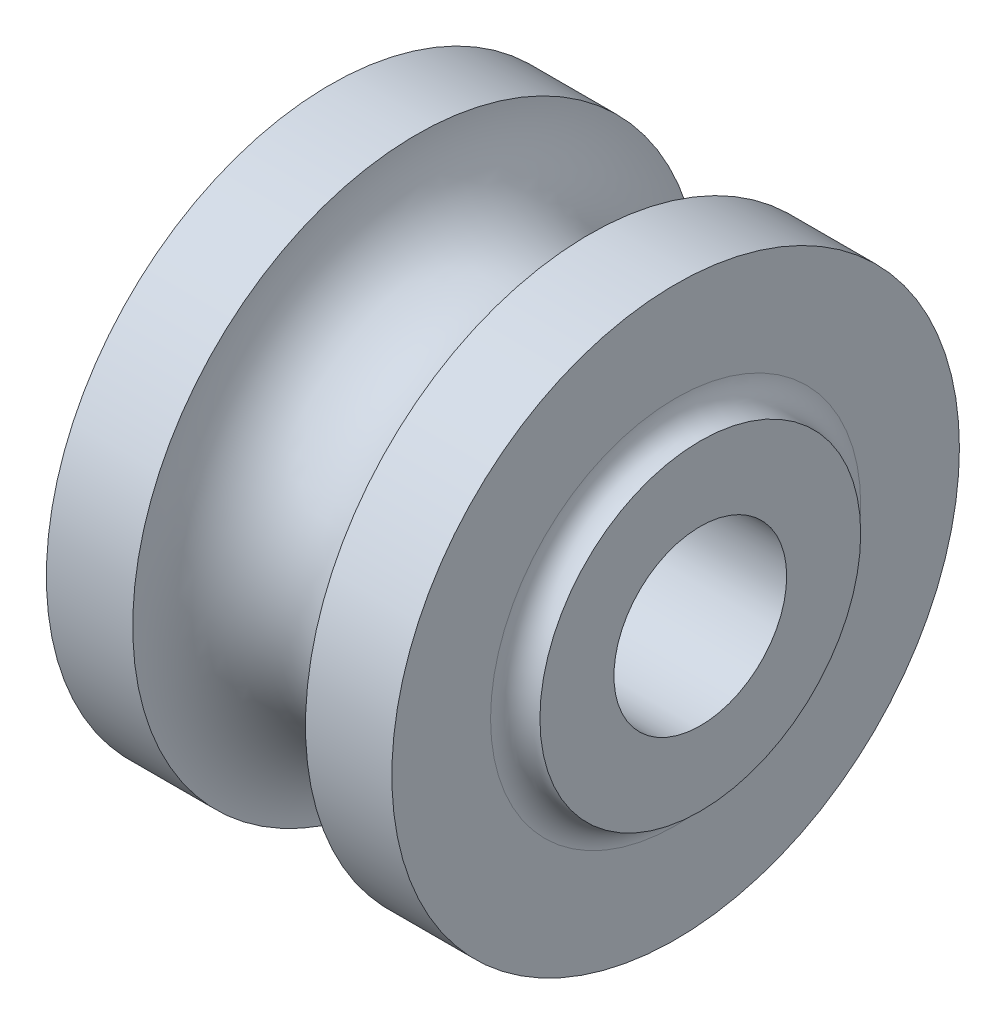
ISO-10303-21;
HEADER;
FILE_DESCRIPTION(('STEP AP214'),'2;1');
FILE_NAME('part.step','',(''),(''),'','','');
FILE_SCHEMA(('AUTOMOTIVE_DESIGN { 1 0 10303 214 1 1 1 1 }'));
ENDSEC;
DATA;
#1=APPLICATION_CONTEXT('core data for automotive mechanical design processes');
#2=APPLICATION_PROTOCOL_DEFINITION('international standard','automotive_design',2000,#1);
#3=PRODUCT_CONTEXT('',#1,'mechanical');
#4=PRODUCT('Part','Part','',(#3));
#5=PRODUCT_RELATED_PRODUCT_CATEGORY('part','',(#4));
#6=PRODUCT_DEFINITION_FORMATION('','',#4);
#7=PRODUCT_DEFINITION_CONTEXT('part definition',#1,'design');
#8=PRODUCT_DEFINITION('design','',#6,#7);
#9=PRODUCT_DEFINITION_SHAPE('','',#8);
#10=(LENGTH_UNIT() NAMED_UNIT(*) SI_UNIT(.MILLI.,.METRE.));
#11=(NAMED_UNIT(*) PLANE_ANGLE_UNIT() SI_UNIT($,.RADIAN.));
#12=(NAMED_UNIT(*) SI_UNIT($,.STERADIAN.) SOLID_ANGLE_UNIT());
#13=UNCERTAINTY_MEASURE_WITH_UNIT(LENGTH_MEASURE(1.E-05),#10,'distance_accuracy_value','');
#14=(GEOMETRIC_REPRESENTATION_CONTEXT(3) GLOBAL_UNCERTAINTY_ASSIGNED_CONTEXT((#13)) GLOBAL_UNIT_ASSIGNED_CONTEXT((#10,
#11,#12)) REPRESENTATION_CONTEXT('',''));
#15=CARTESIAN_POINT('',(0.,0.,0.));
#16=DIRECTION('',(0.,0.,1.));
#17=DIRECTION('',(1.,0.,0.));
#18=AXIS2_PLACEMENT_3D('',#15,#16,#17);
#19=CARTESIAN_POINT('',(0.,0.,0.));
#20=DIRECTION('',(1.,0.,0.));
#21=DIRECTION('',(0.,0.,-1.));
#22=AXIS2_PLACEMENT_3D('',#19,#20,#21);
#23=TOROIDAL_SURFACE('',#22,23.,7.);
#24=CARTESIAN_POINT('',(-7.,0.,0.));
#25=DIRECTION('',(1.,0.,0.));
#26=DIRECTION('',(0.,0.,-1.));
#27=AXIS2_PLACEMENT_3D('',#24,#25,#26);
#28=CIRCLE('',#27,23.);
#29=CARTESIAN_POINT('',(-7.,0.,-23.));
#30=VERTEX_POINT('',#29);
#31=EDGE_CURVE('E56',#30,#30,#28,.T.);
#32=ORIENTED_EDGE('',*,*,#31,.T.);
#33=EDGE_LOOP('',(#32));
#34=FACE_BOUND('',#33,.T.);
#35=CARTESIAN_POINT('',(7.,0.,0.));
#36=DIRECTION('',(1.,0.,0.));
#37=DIRECTION('',(0.,0.,-1.));
#38=AXIS2_PLACEMENT_3D('',#35,#36,#37);
#39=CIRCLE('',#38,23.);
#40=CARTESIAN_POINT('',(7.,0.,-23.));
#41=VERTEX_POINT('',#40);
#42=EDGE_CURVE('E79',#41,#41,#39,.T.);
#43=ORIENTED_EDGE('',*,*,#42,.F.);
#44=EDGE_LOOP('',(#43));
#45=FACE_BOUND('',#44,.T.);
#46=ADVANCED_FACE('F43',(#34,#45),#23,.F.);
#47=CARTESIAN_POINT('',(0.,0.,0.));
#48=DIRECTION('',(1.,0.,0.));
#49=DIRECTION('',(0.,0.,-1.));
#50=AXIS2_PLACEMENT_3D('',#47,#48,#49);
#51=CYLINDRICAL_SURFACE('',#50,23.);
#52=CARTESIAN_POINT('',(-14.,0.,0.));
#53=DIRECTION('',(1.,0.,0.));
#54=DIRECTION('',(0.,0.,-1.));
#55=AXIS2_PLACEMENT_3D('',#52,#53,#54);
#56=CIRCLE('',#55,23.);
#57=CARTESIAN_POINT('',(-14.,0.,-23.));
#58=VERTEX_POINT('',#57);
#59=EDGE_CURVE('E61',#58,#58,#56,.T.);
#60=ORIENTED_EDGE('',*,*,#59,.T.);
#61=EDGE_LOOP('',(#60));
#62=FACE_BOUND('',#61,.T.);
#63=ORIENTED_EDGE('',*,*,#31,.F.);
#64=EDGE_LOOP('',(#63));
#65=FACE_BOUND('',#64,.T.);
#66=ADVANCED_FACE('F115',(#62,#65),#51,.T.);
#67=CARTESIAN_POINT('',(-14.,23.,0.));
#68=DIRECTION('',(-1.,0.,0.));
#69=DIRECTION('',(0.,0.,1.));
#70=AXIS2_PLACEMENT_3D('',#67,#68,#69);
#71=PLANE('',#70);
#72=CARTESIAN_POINT('',(-14.,0.,0.));
#73=DIRECTION('',(-1.,0.,0.));
#74=DIRECTION('',(0.,0.,1.));
#75=AXIS2_PLACEMENT_3D('',#72,#73,#74);
#76=CIRCLE('',#75,15.);
#77=CARTESIAN_POINT('',(-14.,0.,15.));
#78=VERTEX_POINT('',#77);
#79=EDGE_CURVE('E51',#78,#78,#76,.F.);
#80=ORIENTED_EDGE('',*,*,#79,.T.);
#81=EDGE_LOOP('',(#80));
#82=FACE_BOUND('',#81,.T.);
#83=ORIENTED_EDGE('',*,*,#59,.F.);
#84=EDGE_LOOP('',(#83));
#85=FACE_BOUND('',#84,.T.);
#86=ADVANCED_FACE('F121',(#82,#85),#71,.T.);
#87=CARTESIAN_POINT('',(-16.,13.,0.));
#88=DIRECTION('',(-1.,0.,0.));
#89=DIRECTION('',(0.,0.,1.));
#90=AXIS2_PLACEMENT_3D('',#87,#88,#89);
#91=PLANE('',#90);
#92=CARTESIAN_POINT('',(-16.,0.,0.));
#93=DIRECTION('',(1.,0.,0.));
#94=DIRECTION('',(0.,0.,-1.));
#95=AXIS2_PLACEMENT_3D('',#92,#93,#94);
#96=CIRCLE('',#95,7.00000000000001);
#97=CARTESIAN_POINT('',(-16.,0.,-7.00000000000001));
#98=VERTEX_POINT('',#97);
#99=EDGE_CURVE('E83',#98,#98,#96,.T.);
#100=ORIENTED_EDGE('',*,*,#99,.T.);
#101=EDGE_LOOP('',(#100));
#102=FACE_BOUND('',#101,.T.);
#103=CARTESIAN_POINT('',(-16.,0.,0.));
#104=DIRECTION('',(1.,0.,0.));
#105=DIRECTION('',(0.,0.,-1.));
#106=AXIS2_PLACEMENT_3D('',#103,#104,#105);
#107=CIRCLE('',#106,13.);
#108=CARTESIAN_POINT('',(-16.,0.,-13.));
#109=VERTEX_POINT('',#108);
#110=EDGE_CURVE('E67',#109,#109,#107,.T.);
#111=ORIENTED_EDGE('',*,*,#110,.F.);
#112=EDGE_LOOP('',(#111));
#113=FACE_BOUND('',#112,.T.);
#114=ADVANCED_FACE('F98',(#102,#113),#91,.T.);
#115=CARTESIAN_POINT('',(16.,13.,0.));
#116=DIRECTION('',(1.,0.,0.));
#117=DIRECTION('',(0.,0.,-1.));
#118=AXIS2_PLACEMENT_3D('',#115,#116,#117);
#119=PLANE('',#118);
#120=CARTESIAN_POINT('',(16.,0.,0.));
#121=DIRECTION('',(1.,0.,0.));
#122=DIRECTION('',(0.,0.,-1.));
#123=AXIS2_PLACEMENT_3D('',#120,#121,#122);
#124=CIRCLE('',#123,7.00000000000001);
#125=CARTESIAN_POINT('',(16.,0.,-7.00000000000001));
#126=VERTEX_POINT('',#125);
#127=EDGE_CURVE('E87',#126,#126,#124,.T.);
#128=ORIENTED_EDGE('',*,*,#127,.F.);
#129=EDGE_LOOP('',(#128));
#130=FACE_BOUND('',#129,.T.);
#131=CARTESIAN_POINT('',(16.,0.,0.));
#132=DIRECTION('',(1.,0.,0.));
#133=DIRECTION('',(0.,0.,-1.));
#134=AXIS2_PLACEMENT_3D('',#131,#132,#133);
#135=CIRCLE('',#134,13.);
#136=CARTESIAN_POINT('',(16.,0.,-13.));
#137=VERTEX_POINT('',#136);
#138=EDGE_CURVE('E71',#137,#137,#135,.T.);
#139=ORIENTED_EDGE('',*,*,#138,.T.);
#140=EDGE_LOOP('',(#139));
#141=FACE_BOUND('',#140,.T.);
#142=ADVANCED_FACE('F94',(#130,#141),#119,.T.);
#143=CARTESIAN_POINT('',(14.,23.,0.));
#144=DIRECTION('',(1.,0.,0.));
#145=DIRECTION('',(0.,0.,-1.));
#146=AXIS2_PLACEMENT_3D('',#143,#144,#145);
#147=PLANE('',#146);
#148=CARTESIAN_POINT('',(14.,0.,0.));
#149=DIRECTION('',(1.,0.,0.));
#150=DIRECTION('',(0.,0.,-1.));
#151=AXIS2_PLACEMENT_3D('',#148,#149,#150);
#152=CIRCLE('',#151,15.);
#153=CARTESIAN_POINT('',(14.,0.,-15.));
#154=VERTEX_POINT('',#153);
#155=EDGE_CURVE('E10',#154,#154,#152,.F.);
#156=ORIENTED_EDGE('',*,*,#155,.T.);
#157=EDGE_LOOP('',(#156));
#158=FACE_BOUND('',#157,.T.);
#159=CARTESIAN_POINT('',(14.,0.,0.));
#160=DIRECTION('',(1.,0.,0.));
#161=DIRECTION('',(0.,0.,-1.));
#162=AXIS2_PLACEMENT_3D('',#159,#160,#161);
#163=CIRCLE('',#162,23.);
#164=CARTESIAN_POINT('',(14.,0.,-23.));
#165=VERTEX_POINT('',#164);
#166=EDGE_CURVE('E75',#165,#165,#163,.T.);
#167=ORIENTED_EDGE('',*,*,#166,.T.);
#168=EDGE_LOOP('',(#167));
#169=FACE_BOUND('',#168,.T.);
#170=ADVANCED_FACE('F97',(#158,#169),#147,.T.);
#171=CARTESIAN_POINT('',(0.,0.,0.));
#172=DIRECTION('',(1.,0.,0.));
#173=DIRECTION('',(0.,0.,-1.));
#174=AXIS2_PLACEMENT_3D('',#171,#172,#173);
#175=CYLINDRICAL_SURFACE('',#174,23.);
#176=ORIENTED_EDGE('',*,*,#42,.T.);
#177=EDGE_LOOP('',(#176));
#178=FACE_BOUND('',#177,.T.);
#179=ORIENTED_EDGE('',*,*,#166,.F.);
#180=EDGE_LOOP('',(#179));
#181=FACE_BOUND('',#180,.T.);
#182=ADVANCED_FACE('F112',(#178,#181),#175,.T.);
#183=CARTESIAN_POINT('',(-16.,0.,0.));
#184=DIRECTION('',(-1.,0.,0.));
#185=DIRECTION('',(0.,0.,1.));
#186=AXIS2_PLACEMENT_3D('',#183,#184,#185);
#187=TOROIDAL_SURFACE('',#186,15.,2.);
#188=ORIENTED_EDGE('',*,*,#110,.T.);
#189=EDGE_LOOP('',(#188));
#190=FACE_BOUND('',#189,.T.);
#191=ORIENTED_EDGE('',*,*,#79,.F.);
#192=EDGE_LOOP('',(#191));
#193=FACE_BOUND('',#192,.T.);
#194=ADVANCED_FACE('F103',(#190,#193),#187,.F.);
#195=CARTESIAN_POINT('',(16.,0.,0.));
#196=DIRECTION('',(1.,0.,0.));
#197=DIRECTION('',(0.,0.,-1.));
#198=AXIS2_PLACEMENT_3D('',#195,#196,#197);
#199=TOROIDAL_SURFACE('',#198,15.,2.);
#200=ORIENTED_EDGE('',*,*,#155,.F.);
#201=EDGE_LOOP('',(#200));
#202=FACE_BOUND('',#201,.T.);
#203=ORIENTED_EDGE('',*,*,#138,.F.);
#204=EDGE_LOOP('',(#203));
#205=FACE_BOUND('',#204,.T.);
#206=ADVANCED_FACE('F45',(#202,#205),#199,.F.);
#207=CARTESIAN_POINT('',(16.,0.,0.));
#208=DIRECTION('',(1.,0.,0.));
#209=DIRECTION('',(0.,0.,-1.));
#210=AXIS2_PLACEMENT_3D('',#207,#208,#209);
#211=CYLINDRICAL_SURFACE('',#210,7.00000000000001);
#212=ORIENTED_EDGE('',*,*,#99,.F.);
#213=EDGE_LOOP('',(#212));
#214=FACE_BOUND('',#213,.T.);
#215=ORIENTED_EDGE('',*,*,#127,.T.);
#216=EDGE_LOOP('',(#215));
#217=FACE_BOUND('',#216,.T.);
#218=ADVANCED_FACE('F92',(#214,#217),#211,.F.);
#219=CLOSED_SHELL('',(#46,#66,#86,#114,#142,#170,#182,#194,#206,#218));
#220=MANIFOLD_SOLID_BREP('B2',#219);
#221=ADVANCED_BREP_SHAPE_REPRESENTATION('',(#18,#220),#14);
#222=SHAPE_DEFINITION_REPRESENTATION(#9,#221);
ENDSEC;
END-ISO-10303-21;
